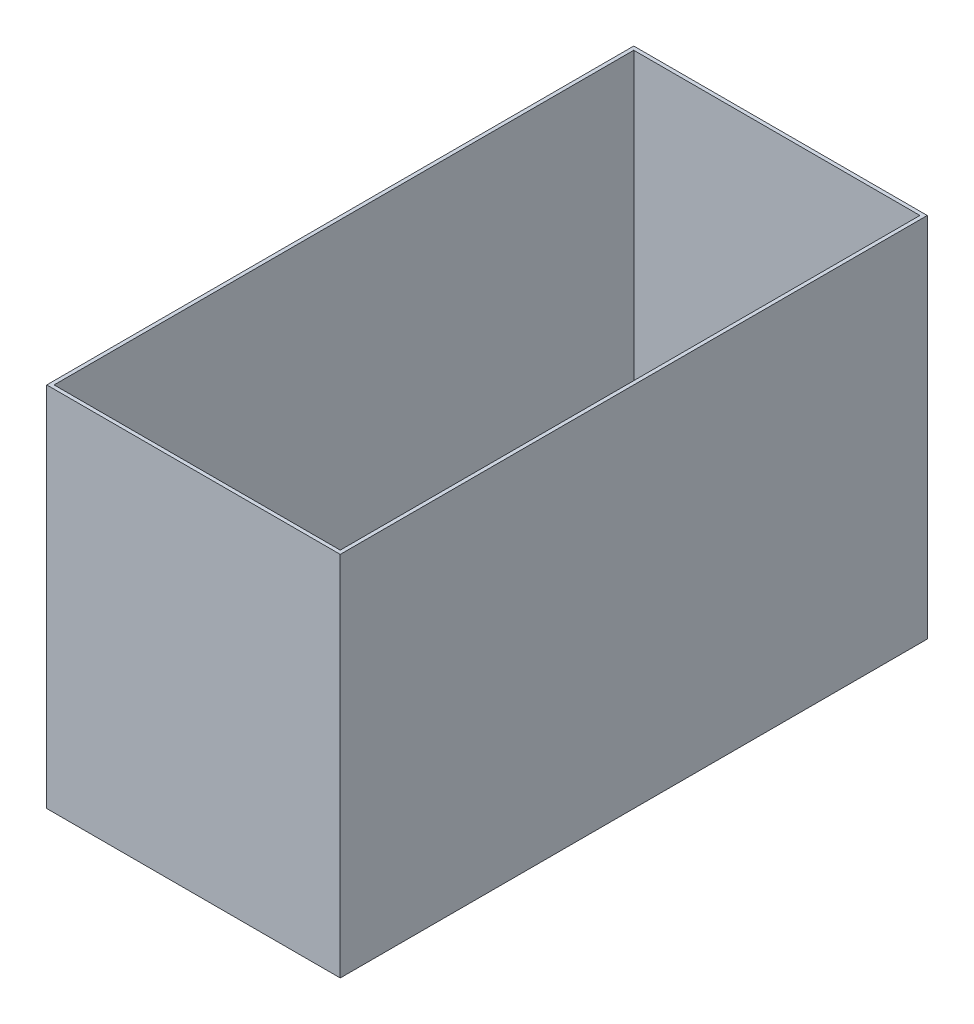
ISO-10303-21;
HEADER;
FILE_DESCRIPTION(('STEP AP214'),'2;1');
FILE_NAME('part.step','',(''),(''),'','','');
FILE_SCHEMA(('AUTOMOTIVE_DESIGN { 1 0 10303 214 1 1 1 1 }'));
ENDSEC;
DATA;
#1=APPLICATION_CONTEXT('core data for automotive mechanical design processes');
#2=APPLICATION_PROTOCOL_DEFINITION('international standard','automotive_design',2000,#1);
#3=PRODUCT_CONTEXT('',#1,'mechanical');
#4=PRODUCT('Part','Part','',(#3));
#5=PRODUCT_RELATED_PRODUCT_CATEGORY('part','',(#4));
#6=PRODUCT_DEFINITION_FORMATION('','',#4);
#7=PRODUCT_DEFINITION_CONTEXT('part definition',#1,'design');
#8=PRODUCT_DEFINITION('design','',#6,#7);
#9=PRODUCT_DEFINITION_SHAPE('','',#8);
#10=(LENGTH_UNIT() NAMED_UNIT(*) SI_UNIT(.MILLI.,.METRE.));
#11=(NAMED_UNIT(*) PLANE_ANGLE_UNIT() SI_UNIT($,.RADIAN.));
#12=(NAMED_UNIT(*) SI_UNIT($,.STERADIAN.) SOLID_ANGLE_UNIT());
#13=UNCERTAINTY_MEASURE_WITH_UNIT(LENGTH_MEASURE(1.E-05),#10,'distance_accuracy_value','');
#14=(GEOMETRIC_REPRESENTATION_CONTEXT(3) GLOBAL_UNCERTAINTY_ASSIGNED_CONTEXT((#13)) GLOBAL_UNIT_ASSIGNED_CONTEXT((#10,
#11,#12)) REPRESENTATION_CONTEXT('',''));
#15=CARTESIAN_POINT('',(0.,0.,0.));
#16=DIRECTION('',(0.,0.,1.));
#17=DIRECTION('',(1.,0.,0.));
#18=AXIS2_PLACEMENT_3D('',#15,#16,#17);
#19=CARTESIAN_POINT('',(0.,254.,0.));
#20=DIRECTION('',(0.,-1.,0.));
#21=DIRECTION('',(0.,0.,-1.));
#22=AXIS2_PLACEMENT_3D('',#19,#20,#21);
#23=PLANE('',#22);
#24=DIRECTION('',(0.,0.,-1.));
#25=VECTOR('',#24,1.);
#26=CARTESIAN_POINT('',(101.6,254.,203.2));
#27=LINE('',#26,#25);
#28=CARTESIAN_POINT('',(101.6,254.,203.2));
#29=VERTEX_POINT('',#28);
#30=CARTESIAN_POINT('',(101.6,254.,-203.2));
#31=VERTEX_POINT('',#30);
#32=EDGE_CURVE('E140',#29,#31,#27,.T.);
#33=ORIENTED_EDGE('',*,*,#32,.T.);
#34=DIRECTION('',(-1.,0.,0.));
#35=VECTOR('',#34,1.);
#36=CARTESIAN_POINT('',(-101.6,254.,-203.2));
#37=LINE('',#36,#35);
#38=CARTESIAN_POINT('',(-101.6,254.,-203.2));
#39=VERTEX_POINT('',#38);
#40=EDGE_CURVE('E84',#31,#39,#37,.T.);
#41=ORIENTED_EDGE('',*,*,#40,.T.);
#42=DIRECTION('',(0.,0.,1.));
#43=VECTOR('',#42,1.);
#44=CARTESIAN_POINT('',(-101.6,254.,203.2));
#45=LINE('',#44,#43);
#46=CARTESIAN_POINT('',(-101.6,254.,203.2));
#47=VERTEX_POINT('',#46);
#48=EDGE_CURVE('E143',#39,#47,#45,.T.);
#49=ORIENTED_EDGE('',*,*,#48,.T.);
#50=DIRECTION('',(1.,0.,0.));
#51=VECTOR('',#50,1.);
#52=CARTESIAN_POINT('',(-101.6,254.,203.2));
#53=LINE('',#52,#51);
#54=EDGE_CURVE('E56',#47,#29,#53,.T.);
#55=ORIENTED_EDGE('',*,*,#54,.T.);
#56=EDGE_LOOP('',(#33,#41,#49,#55));
#57=FACE_BOUND('',#56,.T.);
#58=DIRECTION('',(0.,0.,-1.));
#59=VECTOR('',#58,1.);
#60=CARTESIAN_POINT('',(99.0599999999999,254.,0.));
#61=LINE('',#60,#59);
#62=CARTESIAN_POINT('',(99.0599999999999,254.,200.66));
#63=VERTEX_POINT('',#62);
#64=CARTESIAN_POINT('',(99.0599999999999,254.,-200.66));
#65=VERTEX_POINT('',#64);
#66=EDGE_CURVE('E129',#63,#65,#61,.T.);
#67=ORIENTED_EDGE('',*,*,#66,.F.);
#68=DIRECTION('',(1.,0.,0.));
#69=VECTOR('',#68,1.);
#70=CARTESIAN_POINT('',(0.,254.,200.66));
#71=LINE('',#70,#69);
#72=CARTESIAN_POINT('',(-99.0600000000001,254.,200.66));
#73=VERTEX_POINT('',#72);
#74=EDGE_CURVE('E138',#73,#63,#71,.T.);
#75=ORIENTED_EDGE('',*,*,#74,.F.);
#76=DIRECTION('',(0.,0.,1.));
#77=VECTOR('',#76,1.);
#78=CARTESIAN_POINT('',(-99.0600000000001,254.,0.));
#79=LINE('',#78,#77);
#80=CARTESIAN_POINT('',(-99.0600000000001,254.,-200.66));
#81=VERTEX_POINT('',#80);
#82=EDGE_CURVE('E136',#81,#73,#79,.T.);
#83=ORIENTED_EDGE('',*,*,#82,.F.);
#84=DIRECTION('',(-1.,0.,0.));
#85=VECTOR('',#84,1.);
#86=CARTESIAN_POINT('',(0.,254.,-200.66));
#87=LINE('',#86,#85);
#88=EDGE_CURVE('E121',#65,#81,#87,.T.);
#89=ORIENTED_EDGE('',*,*,#88,.F.);
#90=EDGE_LOOP('',(#67,#75,#83,#89));
#91=FACE_BOUND('',#90,.T.);
#92=ADVANCED_FACE('F32',(#57,#91),#23,.F.);
#93=CARTESIAN_POINT('',(101.6,254.,203.2));
#94=DIRECTION('',(-1.,0.,0.));
#95=DIRECTION('',(0.,0.,1.));
#96=AXIS2_PLACEMENT_3D('',#93,#94,#95);
#97=PLANE('',#96);
#98=DIRECTION('',(0.,0.,-1.));
#99=VECTOR('',#98,1.);
#100=CARTESIAN_POINT('',(101.6,0.,203.2));
#101=LINE('',#100,#99);
#102=CARTESIAN_POINT('',(101.6,0.,203.2));
#103=VERTEX_POINT('',#102);
#104=CARTESIAN_POINT('',(101.6,0.,-203.2));
#105=VERTEX_POINT('',#104);
#106=EDGE_CURVE('E147',#103,#105,#101,.T.);
#107=ORIENTED_EDGE('',*,*,#106,.T.);
#108=DIRECTION('',(0.,-1.,0.));
#109=VECTOR('',#108,1.);
#110=CARTESIAN_POINT('',(101.6,254.,-203.2));
#111=LINE('',#110,#109);
#112=EDGE_CURVE('E11',#31,#105,#111,.T.);
#113=ORIENTED_EDGE('',*,*,#112,.F.);
#114=ORIENTED_EDGE('',*,*,#32,.F.);
#115=DIRECTION('',(0.,-1.,0.));
#116=VECTOR('',#115,1.);
#117=CARTESIAN_POINT('',(101.6,254.,203.2));
#118=LINE('',#117,#116);
#119=EDGE_CURVE('E146',#29,#103,#118,.T.);
#120=ORIENTED_EDGE('',*,*,#119,.T.);
#121=EDGE_LOOP('',(#107,#113,#114,#120));
#122=FACE_BOUND('',#121,.T.);
#123=ADVANCED_FACE('F34',(#122),#97,.F.);
#124=CARTESIAN_POINT('',(-101.6,254.,-203.2));
#125=DIRECTION('',(0.,0.,1.));
#126=DIRECTION('',(1.,0.,0.));
#127=AXIS2_PLACEMENT_3D('',#124,#125,#126);
#128=PLANE('',#127);
#129=DIRECTION('',(-1.,0.,0.));
#130=VECTOR('',#129,1.);
#131=CARTESIAN_POINT('',(-101.6,0.,-203.2));
#132=LINE('',#131,#130);
#133=CARTESIAN_POINT('',(-101.6,0.,-203.2));
#134=VERTEX_POINT('',#133);
#135=EDGE_CURVE('E150',#105,#134,#132,.T.);
#136=ORIENTED_EDGE('',*,*,#135,.T.);
#137=DIRECTION('',(0.,-1.,0.));
#138=VECTOR('',#137,1.);
#139=CARTESIAN_POINT('',(-101.6,254.,-203.2));
#140=LINE('',#139,#138);
#141=EDGE_CURVE('E40',#39,#134,#140,.T.);
#142=ORIENTED_EDGE('',*,*,#141,.F.);
#143=ORIENTED_EDGE('',*,*,#40,.F.);
#144=ORIENTED_EDGE('',*,*,#112,.T.);
#145=EDGE_LOOP('',(#136,#142,#143,#144));
#146=FACE_BOUND('',#145,.T.);
#147=ADVANCED_FACE('F178',(#146),#128,.F.);
#148=CARTESIAN_POINT('',(-101.6,254.,203.2));
#149=DIRECTION('',(1.,0.,0.));
#150=DIRECTION('',(0.,0.,-1.));
#151=AXIS2_PLACEMENT_3D('',#148,#149,#150);
#152=PLANE('',#151);
#153=DIRECTION('',(0.,0.,1.));
#154=VECTOR('',#153,1.);
#155=CARTESIAN_POINT('',(-101.6,0.,203.2));
#156=LINE('',#155,#154);
#157=CARTESIAN_POINT('',(-101.6,0.,203.2));
#158=VERTEX_POINT('',#157);
#159=EDGE_CURVE('E152',#134,#158,#156,.T.);
#160=ORIENTED_EDGE('',*,*,#159,.T.);
#161=DIRECTION('',(0.,-1.,0.));
#162=VECTOR('',#161,1.);
#163=CARTESIAN_POINT('',(-101.6,254.,203.2));
#164=LINE('',#163,#162);
#165=EDGE_CURVE('E156',#47,#158,#164,.T.);
#166=ORIENTED_EDGE('',*,*,#165,.F.);
#167=ORIENTED_EDGE('',*,*,#48,.F.);
#168=ORIENTED_EDGE('',*,*,#141,.T.);
#169=EDGE_LOOP('',(#160,#166,#167,#168));
#170=FACE_BOUND('',#169,.T.);
#171=ADVANCED_FACE('F161',(#170),#152,.F.);
#172=CARTESIAN_POINT('',(-101.6,254.,203.2));
#173=DIRECTION('',(0.,0.,-1.));
#174=DIRECTION('',(-1.,0.,0.));
#175=AXIS2_PLACEMENT_3D('',#172,#173,#174);
#176=PLANE('',#175);
#177=DIRECTION('',(1.,0.,0.));
#178=VECTOR('',#177,1.);
#179=CARTESIAN_POINT('',(-101.6,0.,203.2));
#180=LINE('',#179,#178);
#181=EDGE_CURVE('E77',#158,#103,#180,.T.);
#182=ORIENTED_EDGE('',*,*,#181,.T.);
#183=ORIENTED_EDGE('',*,*,#119,.F.);
#184=ORIENTED_EDGE('',*,*,#54,.F.);
#185=ORIENTED_EDGE('',*,*,#165,.T.);
#186=EDGE_LOOP('',(#182,#183,#184,#185));
#187=FACE_BOUND('',#186,.T.);
#188=ADVANCED_FACE('F169',(#187),#176,.F.);
#189=CARTESIAN_POINT('',(0.,0.,0.));
#190=DIRECTION('',(0.,-1.,0.));
#191=DIRECTION('',(0.,0.,-1.));
#192=AXIS2_PLACEMENT_3D('',#189,#190,#191);
#193=PLANE('',#192);
#194=ORIENTED_EDGE('',*,*,#106,.F.);
#195=ORIENTED_EDGE('',*,*,#181,.F.);
#196=ORIENTED_EDGE('',*,*,#159,.F.);
#197=ORIENTED_EDGE('',*,*,#135,.F.);
#198=EDGE_LOOP('',(#194,#195,#196,#197));
#199=FACE_BOUND('',#198,.T.);
#200=ADVANCED_FACE('F165',(#199),#193,.T.);
#201=CARTESIAN_POINT('',(99.0599999999999,254.,203.2));
#202=DIRECTION('',(-1.,0.,0.));
#203=DIRECTION('',(0.,0.,1.));
#204=AXIS2_PLACEMENT_3D('',#201,#202,#203);
#205=PLANE('',#204);
#206=DIRECTION('',(0.,0.,-1.));
#207=VECTOR('',#206,1.);
#208=CARTESIAN_POINT('',(99.0599999999999,2.54,0.));
#209=LINE('',#208,#207);
#210=CARTESIAN_POINT('',(99.0599999999999,2.54,200.66));
#211=VERTEX_POINT('',#210);
#212=CARTESIAN_POINT('',(99.0599999999999,2.54,-200.66));
#213=VERTEX_POINT('',#212);
#214=EDGE_CURVE('E112',#211,#213,#209,.T.);
#215=ORIENTED_EDGE('',*,*,#214,.F.);
#216=DIRECTION('',(0.,-1.,0.));
#217=VECTOR('',#216,1.);
#218=CARTESIAN_POINT('',(99.0599999999999,254.,200.66));
#219=LINE('',#218,#217);
#220=EDGE_CURVE('E132',#63,#211,#219,.T.);
#221=ORIENTED_EDGE('',*,*,#220,.F.);
#222=ORIENTED_EDGE('',*,*,#66,.T.);
#223=DIRECTION('',(0.,-1.,0.));
#224=VECTOR('',#223,1.);
#225=CARTESIAN_POINT('',(99.0599999999999,254.,-200.66));
#226=LINE('',#225,#224);
#227=EDGE_CURVE('E124',#65,#213,#226,.T.);
#228=ORIENTED_EDGE('',*,*,#227,.T.);
#229=EDGE_LOOP('',(#215,#221,#222,#228));
#230=FACE_BOUND('',#229,.T.);
#231=ADVANCED_FACE('F176',(#230),#205,.T.);
#232=CARTESIAN_POINT('',(-101.6,254.,-200.66));
#233=DIRECTION('',(0.,0.,1.));
#234=DIRECTION('',(1.,0.,0.));
#235=AXIS2_PLACEMENT_3D('',#232,#233,#234);
#236=PLANE('',#235);
#237=DIRECTION('',(-1.,0.,0.));
#238=VECTOR('',#237,1.);
#239=CARTESIAN_POINT('',(0.,2.54,-200.66));
#240=LINE('',#239,#238);
#241=CARTESIAN_POINT('',(-99.0600000000001,2.54,-200.66));
#242=VERTEX_POINT('',#241);
#243=EDGE_CURVE('E106',#213,#242,#240,.T.);
#244=ORIENTED_EDGE('',*,*,#243,.F.);
#245=ORIENTED_EDGE('',*,*,#227,.F.);
#246=ORIENTED_EDGE('',*,*,#88,.T.);
#247=DIRECTION('',(0.,-1.,0.));
#248=VECTOR('',#247,1.);
#249=CARTESIAN_POINT('',(-99.0600000000001,254.,-200.66));
#250=LINE('',#249,#248);
#251=EDGE_CURVE('E118',#81,#242,#250,.T.);
#252=ORIENTED_EDGE('',*,*,#251,.T.);
#253=EDGE_LOOP('',(#244,#245,#246,#252));
#254=FACE_BOUND('',#253,.T.);
#255=ADVANCED_FACE('F119',(#254),#236,.T.);
#256=CARTESIAN_POINT('',(-99.0600000000001,254.,203.2));
#257=DIRECTION('',(1.,0.,0.));
#258=DIRECTION('',(0.,0.,-1.));
#259=AXIS2_PLACEMENT_3D('',#256,#257,#258);
#260=PLANE('',#259);
#261=DIRECTION('',(0.,0.,1.));
#262=VECTOR('',#261,1.);
#263=CARTESIAN_POINT('',(-99.0600000000001,2.54,0.));
#264=LINE('',#263,#262);
#265=CARTESIAN_POINT('',(-99.0600000000001,2.54,200.66));
#266=VERTEX_POINT('',#265);
#267=EDGE_CURVE('E110',#242,#266,#264,.T.);
#268=ORIENTED_EDGE('',*,*,#267,.F.);
#269=ORIENTED_EDGE('',*,*,#251,.F.);
#270=ORIENTED_EDGE('',*,*,#82,.T.);
#271=DIRECTION('',(0.,-1.,0.));
#272=VECTOR('',#271,1.);
#273=CARTESIAN_POINT('',(-99.0600000000001,254.,200.66));
#274=LINE('',#273,#272);
#275=EDGE_CURVE('E47',#73,#266,#274,.T.);
#276=ORIENTED_EDGE('',*,*,#275,.T.);
#277=EDGE_LOOP('',(#268,#269,#270,#276));
#278=FACE_BOUND('',#277,.T.);
#279=ADVANCED_FACE('F126',(#278),#260,.T.);
#280=CARTESIAN_POINT('',(-101.6,254.,200.66));
#281=DIRECTION('',(0.,0.,-1.));
#282=DIRECTION('',(-1.,0.,0.));
#283=AXIS2_PLACEMENT_3D('',#280,#281,#282);
#284=PLANE('',#283);
#285=DIRECTION('',(1.,0.,0.));
#286=VECTOR('',#285,1.);
#287=CARTESIAN_POINT('',(0.,2.54,200.66));
#288=LINE('',#287,#286);
#289=EDGE_CURVE('E127',#266,#211,#288,.T.);
#290=ORIENTED_EDGE('',*,*,#289,.F.);
#291=ORIENTED_EDGE('',*,*,#275,.F.);
#292=ORIENTED_EDGE('',*,*,#74,.T.);
#293=ORIENTED_EDGE('',*,*,#220,.T.);
#294=EDGE_LOOP('',(#290,#291,#292,#293));
#295=FACE_BOUND('',#294,.T.);
#296=ADVANCED_FACE('F189',(#295),#284,.T.);
#297=CARTESIAN_POINT('',(0.,2.54,0.));
#298=DIRECTION('',(0.,-1.,0.));
#299=DIRECTION('',(0.,0.,-1.));
#300=AXIS2_PLACEMENT_3D('',#297,#298,#299);
#301=PLANE('',#300);
#302=ORIENTED_EDGE('',*,*,#214,.T.);
#303=ORIENTED_EDGE('',*,*,#243,.T.);
#304=ORIENTED_EDGE('',*,*,#267,.T.);
#305=ORIENTED_EDGE('',*,*,#289,.T.);
#306=EDGE_LOOP('',(#302,#303,#304,#305));
#307=FACE_BOUND('',#306,.T.);
#308=ADVANCED_FACE('F108',(#307),#301,.F.);
#309=CLOSED_SHELL('',(#92,#123,#147,#171,#188,#200,#231,#255,#279,#296,#308));
#310=MANIFOLD_SOLID_BREP('B2',#309);
#311=ADVANCED_BREP_SHAPE_REPRESENTATION('',(#18,#310),#14);
#312=SHAPE_DEFINITION_REPRESENTATION(#9,#311);
ENDSEC;
END-ISO-10303-21;
